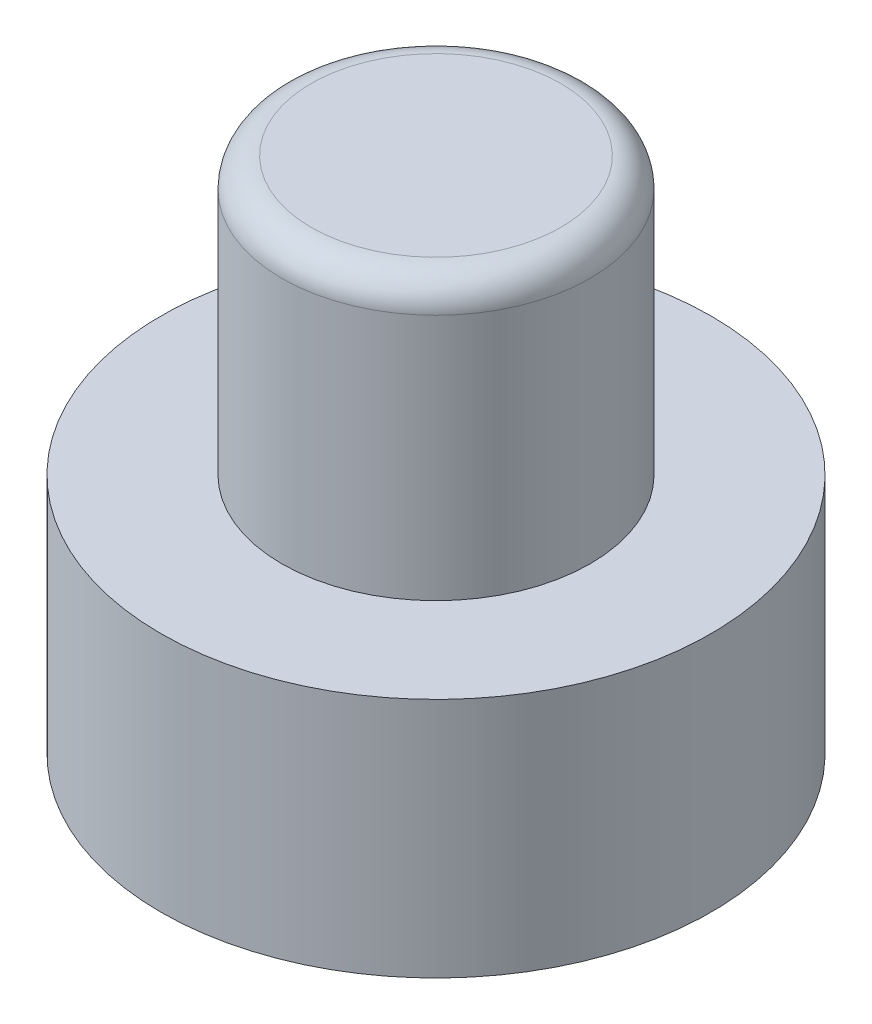
ISO-10303-21;
HEADER;
FILE_DESCRIPTION(('STEP AP214'),'2;1');
FILE_NAME('part.step','',(''),(''),'','','');
FILE_SCHEMA(('AUTOMOTIVE_DESIGN { 1 0 10303 214 1 1 1 1 }'));
ENDSEC;
DATA;
#1=APPLICATION_CONTEXT('core data for automotive mechanical design processes');
#2=APPLICATION_PROTOCOL_DEFINITION('international standard','automotive_design',2000,#1);
#3=PRODUCT_CONTEXT('',#1,'mechanical');
#4=PRODUCT('Part','Part','',(#3));
#5=PRODUCT_RELATED_PRODUCT_CATEGORY('part','',(#4));
#6=PRODUCT_DEFINITION_FORMATION('','',#4);
#7=PRODUCT_DEFINITION_CONTEXT('part definition',#1,'design');
#8=PRODUCT_DEFINITION('design','',#6,#7);
#9=PRODUCT_DEFINITION_SHAPE('','',#8);
#10=(LENGTH_UNIT() NAMED_UNIT(*) SI_UNIT(.MILLI.,.METRE.));
#11=(NAMED_UNIT(*) PLANE_ANGLE_UNIT() SI_UNIT($,.RADIAN.));
#12=(NAMED_UNIT(*) SI_UNIT($,.STERADIAN.) SOLID_ANGLE_UNIT());
#13=UNCERTAINTY_MEASURE_WITH_UNIT(LENGTH_MEASURE(1.E-05),#10,'distance_accuracy_value','');
#14=(GEOMETRIC_REPRESENTATION_CONTEXT(3) GLOBAL_UNCERTAINTY_ASSIGNED_CONTEXT((#13)) GLOBAL_UNIT_ASSIGNED_CONTEXT((#10,
#11,#12)) REPRESENTATION_CONTEXT('',''));
#15=CARTESIAN_POINT('',(0.,0.,0.));
#16=DIRECTION('',(0.,0.,1.));
#17=DIRECTION('',(1.,0.,0.));
#18=AXIS2_PLACEMENT_3D('',#15,#16,#17);
#19=CARTESIAN_POINT('',(0.,4.1,0.));
#20=DIRECTION('',(0.,-1.,0.));
#21=DIRECTION('',(0.,0.,-1.));
#22=AXIS2_PLACEMENT_3D('',#19,#20,#21);
#23=CYLINDRICAL_SURFACE('',#22,4.675);
#24=CARTESIAN_POINT('',(0.,4.1,0.));
#25=DIRECTION('',(0.,1.,0.));
#26=DIRECTION('',(0.,0.,1.));
#27=AXIS2_PLACEMENT_3D('',#24,#25,#26);
#28=CIRCLE('',#27,4.675);
#29=CARTESIAN_POINT('',(0.,4.1,4.675));
#30=VERTEX_POINT('',#29);
#31=EDGE_CURVE('E46',#30,#30,#28,.T.);
#32=ORIENTED_EDGE('',*,*,#31,.F.);
#33=EDGE_LOOP('',(#32));
#34=FACE_BOUND('',#33,.T.);
#35=CARTESIAN_POINT('',(0.,0.,0.));
#36=DIRECTION('',(0.,1.,0.));
#37=DIRECTION('',(0.,0.,1.));
#38=AXIS2_PLACEMENT_3D('',#35,#36,#37);
#39=CIRCLE('',#38,4.675);
#40=CARTESIAN_POINT('',(0.,0.,4.675));
#41=VERTEX_POINT('',#40);
#42=EDGE_CURVE('E49',#41,#41,#39,.T.);
#43=ORIENTED_EDGE('',*,*,#42,.T.);
#44=EDGE_LOOP('',(#43));
#45=FACE_BOUND('',#44,.T.);
#46=ADVANCED_FACE('F31',(#34,#45),#23,.T.);
#47=CARTESIAN_POINT('',(0.,4.1,0.));
#48=DIRECTION('',(0.,1.,0.));
#49=DIRECTION('',(0.,0.,1.));
#50=AXIS2_PLACEMENT_3D('',#47,#48,#49);
#51=PLANE('',#50);
#52=CARTESIAN_POINT('',(0.,4.1,0.));
#53=DIRECTION('',(0.,1.,0.));
#54=DIRECTION('',(0.,0.,1.));
#55=AXIS2_PLACEMENT_3D('',#52,#53,#54);
#56=CIRCLE('',#55,2.62);
#57=CARTESIAN_POINT('',(0.,4.1,2.62));
#58=VERTEX_POINT('',#57);
#59=EDGE_CURVE('E42',#58,#58,#56,.T.);
#60=ORIENTED_EDGE('',*,*,#59,.F.);
#61=EDGE_LOOP('',(#60));
#62=FACE_BOUND('',#61,.T.);
#63=ORIENTED_EDGE('',*,*,#31,.T.);
#64=EDGE_LOOP('',(#63));
#65=FACE_BOUND('',#64,.T.);
#66=ADVANCED_FACE('F55',(#62,#65),#51,.T.);
#67=CARTESIAN_POINT('',(0.,0.,0.));
#68=DIRECTION('',(0.,1.,0.));
#69=DIRECTION('',(0.,0.,1.));
#70=AXIS2_PLACEMENT_3D('',#67,#68,#69);
#71=PLANE('',#70);
#72=ORIENTED_EDGE('',*,*,#42,.F.);
#73=EDGE_LOOP('',(#72));
#74=FACE_BOUND('',#73,.T.);
#75=ADVANCED_FACE('F61',(#74),#71,.F.);
#76=CARTESIAN_POINT('',(0.,8.8,0.));
#77=DIRECTION('',(0.,-1.,0.));
#78=DIRECTION('',(0.,0.,-1.));
#79=AXIS2_PLACEMENT_3D('',#76,#77,#78);
#80=CYLINDRICAL_SURFACE('',#79,2.62);
#81=CARTESIAN_POINT('',(0.,8.3,0.));
#82=DIRECTION('',(0.,1.,0.));
#83=DIRECTION('',(0.,0.,1.));
#84=AXIS2_PLACEMENT_3D('',#81,#82,#83);
#85=CIRCLE('',#84,2.62);
#86=CARTESIAN_POINT('',(0.,8.3,2.62));
#87=VERTEX_POINT('',#86);
#88=EDGE_CURVE('E10',#87,#87,#85,.F.);
#89=ORIENTED_EDGE('',*,*,#88,.T.);
#90=EDGE_LOOP('',(#89));
#91=FACE_BOUND('',#90,.T.);
#92=ORIENTED_EDGE('',*,*,#59,.T.);
#93=EDGE_LOOP('',(#92));
#94=FACE_BOUND('',#93,.T.);
#95=ADVANCED_FACE('F63',(#91,#94),#80,.T.);
#96=CARTESIAN_POINT('',(0.,8.8,0.));
#97=DIRECTION('',(0.,1.,0.));
#98=DIRECTION('',(0.,0.,1.));
#99=AXIS2_PLACEMENT_3D('',#96,#97,#98);
#100=PLANE('',#99);
#101=CARTESIAN_POINT('',(0.,8.8,0.));
#102=DIRECTION('',(0.,1.,0.));
#103=DIRECTION('',(0.,0.,1.));
#104=AXIS2_PLACEMENT_3D('',#101,#102,#103);
#105=CIRCLE('',#104,2.12);
#106=CARTESIAN_POINT('',(0.,8.8,2.12));
#107=VERTEX_POINT('',#106);
#108=EDGE_CURVE('E38',#107,#107,#105,.T.);
#109=ORIENTED_EDGE('',*,*,#108,.T.);
#110=EDGE_LOOP('',(#109));
#111=FACE_BOUND('',#110,.T.);
#112=ADVANCED_FACE('F69',(#111),#100,.T.);
#113=CARTESIAN_POINT('',(0.,8.3,0.));
#114=DIRECTION('',(0.,1.,0.));
#115=DIRECTION('',(0.,0.,1.));
#116=AXIS2_PLACEMENT_3D('',#113,#114,#115);
#117=TOROIDAL_SURFACE('',#116,2.12,0.5);
#118=ORIENTED_EDGE('',*,*,#88,.F.);
#119=EDGE_LOOP('',(#118));
#120=FACE_BOUND('',#119,.T.);
#121=ORIENTED_EDGE('',*,*,#108,.F.);
#122=EDGE_LOOP('',(#121));
#123=FACE_BOUND('',#122,.T.);
#124=ADVANCED_FACE('F33',(#120,#123),#117,.T.);
#125=CLOSED_SHELL('',(#46,#66,#75,#95,#112,#124));
#126=MANIFOLD_SOLID_BREP('B2',#125);
#127=ADVANCED_BREP_SHAPE_REPRESENTATION('',(#18,#126),#14);
#128=SHAPE_DEFINITION_REPRESENTATION(#9,#127);
ENDSEC;
END-ISO-10303-21;
